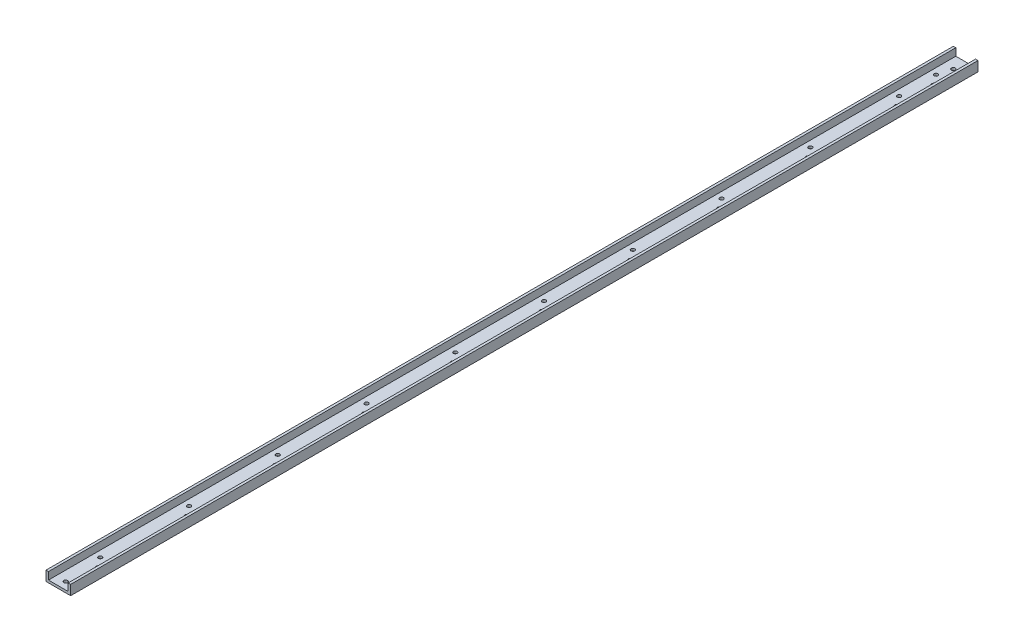
ISO-10303-21;
HEADER;
FILE_DESCRIPTION(('STEP AP214'),'2;1');
FILE_NAME('part.step','',(''),(''),'','','');
FILE_SCHEMA(('AUTOMOTIVE_DESIGN { 1 0 10303 214 1 1 1 1 }'));
ENDSEC;
DATA;
#1=APPLICATION_CONTEXT('core data for automotive mechanical design processes');
#2=APPLICATION_PROTOCOL_DEFINITION('international standard','automotive_design',2000,#1);
#3=PRODUCT_CONTEXT('',#1,'mechanical');
#4=PRODUCT('Part','Part','',(#3));
#5=PRODUCT_RELATED_PRODUCT_CATEGORY('part','',(#4));
#6=PRODUCT_DEFINITION_FORMATION('','',#4);
#7=PRODUCT_DEFINITION_CONTEXT('part definition',#1,'design');
#8=PRODUCT_DEFINITION('design','',#6,#7);
#9=PRODUCT_DEFINITION_SHAPE('','',#8);
#10=(LENGTH_UNIT() NAMED_UNIT(*) SI_UNIT(.MILLI.,.METRE.));
#11=(NAMED_UNIT(*) PLANE_ANGLE_UNIT() SI_UNIT($,.RADIAN.));
#12=(NAMED_UNIT(*) SI_UNIT($,.STERADIAN.) SOLID_ANGLE_UNIT());
#13=UNCERTAINTY_MEASURE_WITH_UNIT(LENGTH_MEASURE(1.E-05),#10,'distance_accuracy_value','');
#14=(GEOMETRIC_REPRESENTATION_CONTEXT(3) GLOBAL_UNCERTAINTY_ASSIGNED_CONTEXT((#13)) GLOBAL_UNIT_ASSIGNED_CONTEXT((#10,
#11,#12)) REPRESENTATION_CONTEXT('',''));
#15=CARTESIAN_POINT('',(0.,0.,0.));
#16=DIRECTION('',(0.,0.,1.));
#17=DIRECTION('',(1.,0.,0.));
#18=AXIS2_PLACEMENT_3D('',#15,#16,#17);
#19=CARTESIAN_POINT('',(20.6375,-0.00100000000000013,93.6624999999999));
#20=DIRECTION('',(0.,1.,0.));
#21=DIRECTION('',(0.,0.,1.));
#22=AXIS2_PLACEMENT_3D('',#19,#20,#21);
#23=CYLINDRICAL_SURFACE('',#22,2.41300000000001);
#24=CARTESIAN_POINT('',(20.6375,3.175,93.6624999999999));
#25=DIRECTION('',(0.,1.,0.));
#26=DIRECTION('',(0.,0.,1.));
#27=AXIS2_PLACEMENT_3D('',#24,#25,#26);
#28=CIRCLE('',#27,2.41300000000001);
#29=CARTESIAN_POINT('',(20.6375,3.175,96.0754999999999));
#30=VERTEX_POINT('',#29);
#31=EDGE_CURVE('E48',#30,#30,#28,.T.);
#32=ORIENTED_EDGE('',*,*,#31,.T.);
#33=EDGE_LOOP('',(#32));
#34=FACE_BOUND('',#33,.T.);
#35=CARTESIAN_POINT('',(20.6375,0.,93.6624999999999));
#36=DIRECTION('',(0.,1.,0.));
#37=DIRECTION('',(0.,0.,1.));
#38=AXIS2_PLACEMENT_3D('',#35,#36,#37);
#39=CIRCLE('',#38,2.41300000000001);
#40=CARTESIAN_POINT('',(20.6375,0.,96.0754999999999));
#41=VERTEX_POINT('',#40);
#42=EDGE_CURVE('E11',#41,#41,#39,.F.);
#43=ORIENTED_EDGE('',*,*,#42,.T.);
#44=EDGE_LOOP('',(#43));
#45=FACE_BOUND('',#44,.T.);
#46=ADVANCED_FACE('F39',(#34,#45),#23,.F.);
#47=CARTESIAN_POINT('',(20.6375,-0.00100000000000013,207.9625));
#48=DIRECTION('',(0.,1.,0.));
#49=DIRECTION('',(0.,0.,1.));
#50=AXIS2_PLACEMENT_3D('',#47,#48,#49);
#51=CYLINDRICAL_SURFACE('',#50,2.41300000000001);
#52=CARTESIAN_POINT('',(20.6375,3.175,207.9625));
#53=DIRECTION('',(0.,1.,0.));
#54=DIRECTION('',(0.,0.,1.));
#55=AXIS2_PLACEMENT_3D('',#52,#53,#54);
#56=CIRCLE('',#55,2.41300000000001);
#57=CARTESIAN_POINT('',(20.6375,3.175,210.3755));
#58=VERTEX_POINT('',#57);
#59=EDGE_CURVE('E274',#58,#58,#56,.T.);
#60=ORIENTED_EDGE('',*,*,#59,.T.);
#61=EDGE_LOOP('',(#60));
#62=FACE_BOUND('',#61,.T.);
#63=CARTESIAN_POINT('',(20.6375,0.,207.9625));
#64=DIRECTION('',(0.,1.,0.));
#65=DIRECTION('',(0.,0.,1.));
#66=AXIS2_PLACEMENT_3D('',#63,#64,#65);
#67=CIRCLE('',#66,2.41300000000001);
#68=CARTESIAN_POINT('',(20.6375,0.,210.3755));
#69=VERTEX_POINT('',#68);
#70=EDGE_CURVE('E277',#69,#69,#67,.F.);
#71=ORIENTED_EDGE('',*,*,#70,.T.);
#72=EDGE_LOOP('',(#71));
#73=FACE_BOUND('',#72,.T.);
#74=ADVANCED_FACE('F301',(#62,#73),#51,.F.);
#75=CARTESIAN_POINT('',(20.6375,-0.00100000000000013,322.2625));
#76=DIRECTION('',(0.,1.,0.));
#77=DIRECTION('',(0.,0.,1.));
#78=AXIS2_PLACEMENT_3D('',#75,#76,#77);
#79=CYLINDRICAL_SURFACE('',#78,2.41300000000001);
#80=CARTESIAN_POINT('',(20.6375,3.175,322.2625));
#81=DIRECTION('',(0.,1.,0.));
#82=DIRECTION('',(0.,0.,1.));
#83=AXIS2_PLACEMENT_3D('',#80,#81,#82);
#84=CIRCLE('',#83,2.41300000000001);
#85=CARTESIAN_POINT('',(20.6375,3.175,324.6755));
#86=VERTEX_POINT('',#85);
#87=EDGE_CURVE('E268',#86,#86,#84,.T.);
#88=ORIENTED_EDGE('',*,*,#87,.T.);
#89=EDGE_LOOP('',(#88));
#90=FACE_BOUND('',#89,.T.);
#91=CARTESIAN_POINT('',(20.6375,0.,322.2625));
#92=DIRECTION('',(0.,1.,0.));
#93=DIRECTION('',(0.,0.,1.));
#94=AXIS2_PLACEMENT_3D('',#91,#92,#93);
#95=CIRCLE('',#94,2.41300000000001);
#96=CARTESIAN_POINT('',(20.6375,0.,324.6755));
#97=VERTEX_POINT('',#96);
#98=EDGE_CURVE('E271',#97,#97,#95,.F.);
#99=ORIENTED_EDGE('',*,*,#98,.T.);
#100=EDGE_LOOP('',(#99));
#101=FACE_BOUND('',#100,.T.);
#102=ADVANCED_FACE('F305',(#90,#101),#79,.F.);
#103=CARTESIAN_POINT('',(20.6375,-0.00100000000000013,436.5625));
#104=DIRECTION('',(0.,1.,0.));
#105=DIRECTION('',(0.,0.,1.));
#106=AXIS2_PLACEMENT_3D('',#103,#104,#105);
#107=CYLINDRICAL_SURFACE('',#106,2.41300000000001);
#108=CARTESIAN_POINT('',(20.6375,3.175,436.5625));
#109=DIRECTION('',(0.,1.,0.));
#110=DIRECTION('',(0.,0.,1.));
#111=AXIS2_PLACEMENT_3D('',#108,#109,#110);
#112=CIRCLE('',#111,2.41300000000001);
#113=CARTESIAN_POINT('',(20.6375,3.175,438.9755));
#114=VERTEX_POINT('',#113);
#115=EDGE_CURVE('E262',#114,#114,#112,.T.);
#116=ORIENTED_EDGE('',*,*,#115,.T.);
#117=EDGE_LOOP('',(#116));
#118=FACE_BOUND('',#117,.T.);
#119=CARTESIAN_POINT('',(20.6375,0.,436.5625));
#120=DIRECTION('',(0.,1.,0.));
#121=DIRECTION('',(0.,0.,1.));
#122=AXIS2_PLACEMENT_3D('',#119,#120,#121);
#123=CIRCLE('',#122,2.41300000000001);
#124=CARTESIAN_POINT('',(20.6375,0.,438.9755));
#125=VERTEX_POINT('',#124);
#126=EDGE_CURVE('E265',#125,#125,#123,.F.);
#127=ORIENTED_EDGE('',*,*,#126,.T.);
#128=EDGE_LOOP('',(#127));
#129=FACE_BOUND('',#128,.T.);
#130=ADVANCED_FACE('F310',(#118,#129),#107,.F.);
#131=CARTESIAN_POINT('',(20.6375,-0.00100000000000013,550.8625));
#132=DIRECTION('',(0.,1.,0.));
#133=DIRECTION('',(0.,0.,1.));
#134=AXIS2_PLACEMENT_3D('',#131,#132,#133);
#135=CYLINDRICAL_SURFACE('',#134,2.41300000000001);
#136=CARTESIAN_POINT('',(20.6375,3.175,550.8625));
#137=DIRECTION('',(0.,1.,0.));
#138=DIRECTION('',(0.,0.,1.));
#139=AXIS2_PLACEMENT_3D('',#136,#137,#138);
#140=CIRCLE('',#139,2.41300000000001);
#141=CARTESIAN_POINT('',(20.6375,3.175,553.2755));
#142=VERTEX_POINT('',#141);
#143=EDGE_CURVE('E256',#142,#142,#140,.T.);
#144=ORIENTED_EDGE('',*,*,#143,.T.);
#145=EDGE_LOOP('',(#144));
#146=FACE_BOUND('',#145,.T.);
#147=CARTESIAN_POINT('',(20.6375,0.,550.8625));
#148=DIRECTION('',(0.,1.,0.));
#149=DIRECTION('',(0.,0.,1.));
#150=AXIS2_PLACEMENT_3D('',#147,#148,#149);
#151=CIRCLE('',#150,2.41300000000001);
#152=CARTESIAN_POINT('',(20.6375,0.,553.2755));
#153=VERTEX_POINT('',#152);
#154=EDGE_CURVE('E259',#153,#153,#151,.F.);
#155=ORIENTED_EDGE('',*,*,#154,.T.);
#156=EDGE_LOOP('',(#155));
#157=FACE_BOUND('',#156,.T.);
#158=ADVANCED_FACE('F317',(#146,#157),#135,.F.);
#159=CARTESIAN_POINT('',(20.6375,-0.00100000000000013,665.1625));
#160=DIRECTION('',(0.,1.,0.));
#161=DIRECTION('',(0.,0.,1.));
#162=AXIS2_PLACEMENT_3D('',#159,#160,#161);
#163=CYLINDRICAL_SURFACE('',#162,2.41300000000001);
#164=CARTESIAN_POINT('',(20.6375,3.175,665.1625));
#165=DIRECTION('',(0.,1.,0.));
#166=DIRECTION('',(0.,0.,1.));
#167=AXIS2_PLACEMENT_3D('',#164,#165,#166);
#168=CIRCLE('',#167,2.41300000000001);
#169=CARTESIAN_POINT('',(20.6375,3.175,667.5755));
#170=VERTEX_POINT('',#169);
#171=EDGE_CURVE('E250',#170,#170,#168,.T.);
#172=ORIENTED_EDGE('',*,*,#171,.T.);
#173=EDGE_LOOP('',(#172));
#174=FACE_BOUND('',#173,.T.);
#175=CARTESIAN_POINT('',(20.6375,0.,665.1625));
#176=DIRECTION('',(0.,1.,0.));
#177=DIRECTION('',(0.,0.,1.));
#178=AXIS2_PLACEMENT_3D('',#175,#176,#177);
#179=CIRCLE('',#178,2.41300000000001);
#180=CARTESIAN_POINT('',(20.6375,0.,667.5755));
#181=VERTEX_POINT('',#180);
#182=EDGE_CURVE('E253',#181,#181,#179,.F.);
#183=ORIENTED_EDGE('',*,*,#182,.T.);
#184=EDGE_LOOP('',(#183));
#185=FACE_BOUND('',#184,.T.);
#186=ADVANCED_FACE('F321',(#174,#185),#163,.F.);
#187=CARTESIAN_POINT('',(20.6375,-0.00100000000000013,779.4625));
#188=DIRECTION('',(0.,1.,0.));
#189=DIRECTION('',(0.,0.,1.));
#190=AXIS2_PLACEMENT_3D('',#187,#188,#189);
#191=CYLINDRICAL_SURFACE('',#190,2.41300000000001);
#192=CARTESIAN_POINT('',(20.6375,3.175,779.4625));
#193=DIRECTION('',(0.,1.,0.));
#194=DIRECTION('',(0.,0.,1.));
#195=AXIS2_PLACEMENT_3D('',#192,#193,#194);
#196=CIRCLE('',#195,2.41300000000001);
#197=CARTESIAN_POINT('',(20.6375,3.175,781.8755));
#198=VERTEX_POINT('',#197);
#199=EDGE_CURVE('E244',#198,#198,#196,.T.);
#200=ORIENTED_EDGE('',*,*,#199,.T.);
#201=EDGE_LOOP('',(#200));
#202=FACE_BOUND('',#201,.T.);
#203=CARTESIAN_POINT('',(20.6375,0.,779.4625));
#204=DIRECTION('',(0.,1.,0.));
#205=DIRECTION('',(0.,0.,1.));
#206=AXIS2_PLACEMENT_3D('',#203,#204,#205);
#207=CIRCLE('',#206,2.41300000000001);
#208=CARTESIAN_POINT('',(20.6375,0.,781.8755));
#209=VERTEX_POINT('',#208);
#210=EDGE_CURVE('E247',#209,#209,#207,.F.);
#211=ORIENTED_EDGE('',*,*,#210,.T.);
#212=EDGE_LOOP('',(#211));
#213=FACE_BOUND('',#212,.T.);
#214=ADVANCED_FACE('F325',(#202,#213),#191,.F.);
#215=CARTESIAN_POINT('',(20.6375,-0.00100000000000013,893.7625));
#216=DIRECTION('',(0.,1.,0.));
#217=DIRECTION('',(0.,0.,1.));
#218=AXIS2_PLACEMENT_3D('',#215,#216,#217);
#219=CYLINDRICAL_SURFACE('',#218,2.41300000000001);
#220=CARTESIAN_POINT('',(20.6375,3.175,893.7625));
#221=DIRECTION('',(0.,1.,0.));
#222=DIRECTION('',(0.,0.,1.));
#223=AXIS2_PLACEMENT_3D('',#220,#221,#222);
#224=CIRCLE('',#223,2.41300000000001);
#225=CARTESIAN_POINT('',(20.6375,3.175,896.1755));
#226=VERTEX_POINT('',#225);
#227=EDGE_CURVE('E238',#226,#226,#224,.T.);
#228=ORIENTED_EDGE('',*,*,#227,.T.);
#229=EDGE_LOOP('',(#228));
#230=FACE_BOUND('',#229,.T.);
#231=CARTESIAN_POINT('',(20.6375,0.,893.7625));
#232=DIRECTION('',(0.,1.,0.));
#233=DIRECTION('',(0.,0.,1.));
#234=AXIS2_PLACEMENT_3D('',#231,#232,#233);
#235=CIRCLE('',#234,2.41300000000001);
#236=CARTESIAN_POINT('',(20.6375,0.,896.1755));
#237=VERTEX_POINT('',#236);
#238=EDGE_CURVE('E241',#237,#237,#235,.F.);
#239=ORIENTED_EDGE('',*,*,#238,.T.);
#240=EDGE_LOOP('',(#239));
#241=FACE_BOUND('',#240,.T.);
#242=ADVANCED_FACE('F329',(#230,#241),#219,.F.);
#243=CARTESIAN_POINT('',(11.1125,-0.00100000000000013,80.9625));
#244=DIRECTION('',(0.,1.,0.));
#245=DIRECTION('',(0.,0.,1.));
#246=AXIS2_PLACEMENT_3D('',#243,#244,#245);
#247=CYLINDRICAL_SURFACE('',#246,2.41300000000005);
#248=CARTESIAN_POINT('',(11.1125,3.175,80.9625));
#249=DIRECTION('',(0.,1.,0.));
#250=DIRECTION('',(0.,0.,1.));
#251=AXIS2_PLACEMENT_3D('',#248,#249,#250);
#252=CIRCLE('',#251,2.41300000000005);
#253=CARTESIAN_POINT('',(11.1125,3.175,83.3755000000001));
#254=VERTEX_POINT('',#253);
#255=EDGE_CURVE('E231',#254,#254,#252,.T.);
#256=ORIENTED_EDGE('',*,*,#255,.T.);
#257=EDGE_LOOP('',(#256));
#258=FACE_BOUND('',#257,.T.);
#259=CARTESIAN_POINT('',(11.1125,0.,80.9625));
#260=DIRECTION('',(0.,1.,0.));
#261=DIRECTION('',(0.,0.,1.));
#262=AXIS2_PLACEMENT_3D('',#259,#260,#261);
#263=CIRCLE('',#262,2.41300000000005);
#264=CARTESIAN_POINT('',(11.1125,0.,83.3755000000001));
#265=VERTEX_POINT('',#264);
#266=EDGE_CURVE('E234',#265,#265,#263,.F.);
#267=ORIENTED_EDGE('',*,*,#266,.T.);
#268=EDGE_LOOP('',(#267));
#269=FACE_BOUND('',#268,.T.);
#270=ADVANCED_FACE('F333',(#258,#269),#247,.F.);
#271=CARTESIAN_POINT('',(11.1125,-0.00100000000000013,195.2625));
#272=DIRECTION('',(0.,1.,0.));
#273=DIRECTION('',(0.,0.,1.));
#274=AXIS2_PLACEMENT_3D('',#271,#272,#273);
#275=CYLINDRICAL_SURFACE('',#274,2.41300000000005);
#276=CARTESIAN_POINT('',(11.1125,3.175,195.2625));
#277=DIRECTION('',(0.,1.,0.));
#278=DIRECTION('',(0.,0.,1.));
#279=AXIS2_PLACEMENT_3D('',#276,#277,#278);
#280=CIRCLE('',#279,2.41300000000005);
#281=CARTESIAN_POINT('',(11.1125,3.175,197.6755));
#282=VERTEX_POINT('',#281);
#283=EDGE_CURVE('E225',#282,#282,#280,.T.);
#284=ORIENTED_EDGE('',*,*,#283,.T.);
#285=EDGE_LOOP('',(#284));
#286=FACE_BOUND('',#285,.T.);
#287=CARTESIAN_POINT('',(11.1125,0.,195.2625));
#288=DIRECTION('',(0.,1.,0.));
#289=DIRECTION('',(0.,0.,1.));
#290=AXIS2_PLACEMENT_3D('',#287,#288,#289);
#291=CIRCLE('',#290,2.41300000000005);
#292=CARTESIAN_POINT('',(11.1125,0.,197.6755));
#293=VERTEX_POINT('',#292);
#294=EDGE_CURVE('E228',#293,#293,#291,.F.);
#295=ORIENTED_EDGE('',*,*,#294,.T.);
#296=EDGE_LOOP('',(#295));
#297=FACE_BOUND('',#296,.T.);
#298=ADVANCED_FACE('F337',(#286,#297),#275,.F.);
#299=CARTESIAN_POINT('',(11.1125,-0.00100000000000013,309.5625));
#300=DIRECTION('',(0.,1.,0.));
#301=DIRECTION('',(0.,0.,1.));
#302=AXIS2_PLACEMENT_3D('',#299,#300,#301);
#303=CYLINDRICAL_SURFACE('',#302,2.41300000000005);
#304=CARTESIAN_POINT('',(11.1125,3.175,309.5625));
#305=DIRECTION('',(0.,1.,0.));
#306=DIRECTION('',(0.,0.,1.));
#307=AXIS2_PLACEMENT_3D('',#304,#305,#306);
#308=CIRCLE('',#307,2.41300000000005);
#309=CARTESIAN_POINT('',(11.1125,3.175,311.9755));
#310=VERTEX_POINT('',#309);
#311=EDGE_CURVE('E219',#310,#310,#308,.T.);
#312=ORIENTED_EDGE('',*,*,#311,.T.);
#313=EDGE_LOOP('',(#312));
#314=FACE_BOUND('',#313,.T.);
#315=CARTESIAN_POINT('',(11.1125,0.,309.5625));
#316=DIRECTION('',(0.,1.,0.));
#317=DIRECTION('',(0.,0.,1.));
#318=AXIS2_PLACEMENT_3D('',#315,#316,#317);
#319=CIRCLE('',#318,2.41300000000005);
#320=CARTESIAN_POINT('',(11.1125,0.,311.9755));
#321=VERTEX_POINT('',#320);
#322=EDGE_CURVE('E222',#321,#321,#319,.F.);
#323=ORIENTED_EDGE('',*,*,#322,.T.);
#324=EDGE_LOOP('',(#323));
#325=FACE_BOUND('',#324,.T.);
#326=ADVANCED_FACE('F341',(#314,#325),#303,.F.);
#327=CARTESIAN_POINT('',(11.1125,-0.00100000000000013,423.8625));
#328=DIRECTION('',(0.,1.,0.));
#329=DIRECTION('',(0.,0.,1.));
#330=AXIS2_PLACEMENT_3D('',#327,#328,#329);
#331=CYLINDRICAL_SURFACE('',#330,2.41300000000005);
#332=CARTESIAN_POINT('',(11.1125,3.175,423.8625));
#333=DIRECTION('',(0.,1.,0.));
#334=DIRECTION('',(0.,0.,1.));
#335=AXIS2_PLACEMENT_3D('',#332,#333,#334);
#336=CIRCLE('',#335,2.41300000000005);
#337=CARTESIAN_POINT('',(11.1125,3.175,426.2755));
#338=VERTEX_POINT('',#337);
#339=EDGE_CURVE('E213',#338,#338,#336,.T.);
#340=ORIENTED_EDGE('',*,*,#339,.T.);
#341=EDGE_LOOP('',(#340));
#342=FACE_BOUND('',#341,.T.);
#343=CARTESIAN_POINT('',(11.1125,0.,423.8625));
#344=DIRECTION('',(0.,1.,0.));
#345=DIRECTION('',(0.,0.,1.));
#346=AXIS2_PLACEMENT_3D('',#343,#344,#345);
#347=CIRCLE('',#346,2.41300000000005);
#348=CARTESIAN_POINT('',(11.1125,0.,426.2755));
#349=VERTEX_POINT('',#348);
#350=EDGE_CURVE('E216',#349,#349,#347,.F.);
#351=ORIENTED_EDGE('',*,*,#350,.T.);
#352=EDGE_LOOP('',(#351));
#353=FACE_BOUND('',#352,.T.);
#354=ADVANCED_FACE('F345',(#342,#353),#331,.F.);
#355=CARTESIAN_POINT('',(11.1125,-0.00100000000000013,538.1625));
#356=DIRECTION('',(0.,1.,0.));
#357=DIRECTION('',(0.,0.,1.));
#358=AXIS2_PLACEMENT_3D('',#355,#356,#357);
#359=CYLINDRICAL_SURFACE('',#358,2.41300000000005);
#360=CARTESIAN_POINT('',(11.1125,3.175,538.1625));
#361=DIRECTION('',(0.,1.,0.));
#362=DIRECTION('',(0.,0.,1.));
#363=AXIS2_PLACEMENT_3D('',#360,#361,#362);
#364=CIRCLE('',#363,2.41300000000005);
#365=CARTESIAN_POINT('',(11.1125,3.175,540.5755));
#366=VERTEX_POINT('',#365);
#367=EDGE_CURVE('E207',#366,#366,#364,.T.);
#368=ORIENTED_EDGE('',*,*,#367,.T.);
#369=EDGE_LOOP('',(#368));
#370=FACE_BOUND('',#369,.T.);
#371=CARTESIAN_POINT('',(11.1125,0.,538.1625));
#372=DIRECTION('',(0.,1.,0.));
#373=DIRECTION('',(0.,0.,1.));
#374=AXIS2_PLACEMENT_3D('',#371,#372,#373);
#375=CIRCLE('',#374,2.41300000000005);
#376=CARTESIAN_POINT('',(11.1125,0.,540.5755));
#377=VERTEX_POINT('',#376);
#378=EDGE_CURVE('E210',#377,#377,#375,.F.);
#379=ORIENTED_EDGE('',*,*,#378,.T.);
#380=EDGE_LOOP('',(#379));
#381=FACE_BOUND('',#380,.T.);
#382=ADVANCED_FACE('F349',(#370,#381),#359,.F.);
#383=CARTESIAN_POINT('',(11.1125,-0.00100000000000013,652.4625));
#384=DIRECTION('',(0.,1.,0.));
#385=DIRECTION('',(0.,0.,1.));
#386=AXIS2_PLACEMENT_3D('',#383,#384,#385);
#387=CYLINDRICAL_SURFACE('',#386,2.41300000000005);
#388=CARTESIAN_POINT('',(11.1125,3.175,652.4625));
#389=DIRECTION('',(0.,1.,0.));
#390=DIRECTION('',(0.,0.,1.));
#391=AXIS2_PLACEMENT_3D('',#388,#389,#390);
#392=CIRCLE('',#391,2.41300000000005);
#393=CARTESIAN_POINT('',(11.1125,3.175,654.8755));
#394=VERTEX_POINT('',#393);
#395=EDGE_CURVE('E201',#394,#394,#392,.T.);
#396=ORIENTED_EDGE('',*,*,#395,.T.);
#397=EDGE_LOOP('',(#396));
#398=FACE_BOUND('',#397,.T.);
#399=CARTESIAN_POINT('',(11.1125,0.,652.4625));
#400=DIRECTION('',(0.,1.,0.));
#401=DIRECTION('',(0.,0.,1.));
#402=AXIS2_PLACEMENT_3D('',#399,#400,#401);
#403=CIRCLE('',#402,2.41300000000005);
#404=CARTESIAN_POINT('',(11.1125,0.,654.8755));
#405=VERTEX_POINT('',#404);
#406=EDGE_CURVE('E204',#405,#405,#403,.F.);
#407=ORIENTED_EDGE('',*,*,#406,.T.);
#408=EDGE_LOOP('',(#407));
#409=FACE_BOUND('',#408,.T.);
#410=ADVANCED_FACE('F353',(#398,#409),#387,.F.);
#411=CARTESIAN_POINT('',(11.1125,-0.00100000000000013,766.7625));
#412=DIRECTION('',(0.,1.,0.));
#413=DIRECTION('',(0.,0.,1.));
#414=AXIS2_PLACEMENT_3D('',#411,#412,#413);
#415=CYLINDRICAL_SURFACE('',#414,2.41300000000005);
#416=CARTESIAN_POINT('',(11.1125,3.175,766.7625));
#417=DIRECTION('',(0.,1.,0.));
#418=DIRECTION('',(0.,0.,1.));
#419=AXIS2_PLACEMENT_3D('',#416,#417,#418);
#420=CIRCLE('',#419,2.41300000000005);
#421=CARTESIAN_POINT('',(11.1125,3.175,769.1755));
#422=VERTEX_POINT('',#421);
#423=EDGE_CURVE('E195',#422,#422,#420,.T.);
#424=ORIENTED_EDGE('',*,*,#423,.T.);
#425=EDGE_LOOP('',(#424));
#426=FACE_BOUND('',#425,.T.);
#427=CARTESIAN_POINT('',(11.1125,0.,766.7625));
#428=DIRECTION('',(0.,1.,0.));
#429=DIRECTION('',(0.,0.,1.));
#430=AXIS2_PLACEMENT_3D('',#427,#428,#429);
#431=CIRCLE('',#430,2.41300000000005);
#432=CARTESIAN_POINT('',(11.1125,0.,769.1755));
#433=VERTEX_POINT('',#432);
#434=EDGE_CURVE('E198',#433,#433,#431,.F.);
#435=ORIENTED_EDGE('',*,*,#434,.T.);
#436=EDGE_LOOP('',(#435));
#437=FACE_BOUND('',#436,.T.);
#438=ADVANCED_FACE('F357',(#426,#437),#415,.F.);
#439=CARTESIAN_POINT('',(11.1125,-0.00100000000000013,881.0625));
#440=DIRECTION('',(0.,1.,0.));
#441=DIRECTION('',(0.,0.,1.));
#442=AXIS2_PLACEMENT_3D('',#439,#440,#441);
#443=CYLINDRICAL_SURFACE('',#442,2.41300000000005);
#444=CARTESIAN_POINT('',(11.1125,3.175,881.0625));
#445=DIRECTION('',(0.,1.,0.));
#446=DIRECTION('',(0.,0.,1.));
#447=AXIS2_PLACEMENT_3D('',#444,#445,#446);
#448=CIRCLE('',#447,2.41300000000005);
#449=CARTESIAN_POINT('',(11.1125,3.175,883.4755));
#450=VERTEX_POINT('',#449);
#451=EDGE_CURVE('E189',#450,#450,#448,.T.);
#452=ORIENTED_EDGE('',*,*,#451,.T.);
#453=EDGE_LOOP('',(#452));
#454=FACE_BOUND('',#453,.T.);
#455=CARTESIAN_POINT('',(11.1125,0.,881.0625));
#456=DIRECTION('',(0.,1.,0.));
#457=DIRECTION('',(0.,0.,1.));
#458=AXIS2_PLACEMENT_3D('',#455,#456,#457);
#459=CIRCLE('',#458,2.41300000000005);
#460=CARTESIAN_POINT('',(11.1125,0.,883.4755));
#461=VERTEX_POINT('',#460);
#462=EDGE_CURVE('E192',#461,#461,#459,.F.);
#463=ORIENTED_EDGE('',*,*,#462,.T.);
#464=EDGE_LOOP('',(#463));
#465=FACE_BOUND('',#464,.T.);
#466=ADVANCED_FACE('F361',(#454,#465),#443,.F.);
#467=CARTESIAN_POINT('',(0.,0.,1168.4));
#468=DIRECTION('',(1.,0.,0.));
#469=DIRECTION('',(0.,0.,-1.));
#470=AXIS2_PLACEMENT_3D('',#467,#468,#469);
#471=PLANE('',#470);
#472=DIRECTION('',(0.,-1.,0.));
#473=VECTOR('',#472,1.);
#474=CARTESIAN_POINT('',(0.,0.,0.));
#475=LINE('',#474,#473);
#476=CARTESIAN_POINT('',(0.,12.7,0.));
#477=VERTEX_POINT('',#476);
#478=CARTESIAN_POINT('',(0.,0.,0.));
#479=VERTEX_POINT('',#478);
#480=EDGE_CURVE('E145',#477,#479,#475,.T.);
#481=ORIENTED_EDGE('',*,*,#480,.T.);
#482=DIRECTION('',(0.,0.,-1.));
#483=VECTOR('',#482,1.);
#484=CARTESIAN_POINT('',(0.,0.,1168.4));
#485=LINE('',#484,#483);
#486=CARTESIAN_POINT('',(0.,0.,1168.4));
#487=VERTEX_POINT('',#486);
#488=EDGE_CURVE('E187',#487,#479,#485,.T.);
#489=ORIENTED_EDGE('',*,*,#488,.F.);
#490=DIRECTION('',(0.,-1.,0.));
#491=VECTOR('',#490,1.);
#492=CARTESIAN_POINT('',(0.,0.,1168.4));
#493=LINE('',#492,#491);
#494=CARTESIAN_POINT('',(0.,12.7,1168.4));
#495=VERTEX_POINT('',#494);
#496=EDGE_CURVE('E168',#495,#487,#493,.T.);
#497=ORIENTED_EDGE('',*,*,#496,.F.);
#498=DIRECTION('',(0.,0.,-1.));
#499=VECTOR('',#498,1.);
#500=CARTESIAN_POINT('',(0.,12.7,1168.4));
#501=LINE('',#500,#499);
#502=EDGE_CURVE('E141',#495,#477,#501,.T.);
#503=ORIENTED_EDGE('',*,*,#502,.T.);
#504=EDGE_LOOP('',(#481,#489,#497,#503));
#505=FACE_BOUND('',#504,.T.);
#506=ADVANCED_FACE('F365',(#505),#471,.F.);
#507=CARTESIAN_POINT('',(0.,0.,1168.4));
#508=DIRECTION('',(0.,1.,0.));
#509=DIRECTION('',(0.,0.,1.));
#510=AXIS2_PLACEMENT_3D('',#507,#508,#509);
#511=PLANE('',#510);
#512=CARTESIAN_POINT('',(15.875,0.,15.875));
#513=DIRECTION('',(0.,1.,0.));
#514=DIRECTION('',(0.,0.,1.));
#515=AXIS2_PLACEMENT_3D('',#512,#513,#514);
#516=CIRCLE('',#515,2.413);
#517=CARTESIAN_POINT('',(15.875,0.,18.288));
#518=VERTEX_POINT('',#517);
#519=EDGE_CURVE('E438',#518,#518,#516,.F.);
#520=ORIENTED_EDGE('',*,*,#519,.F.);
#521=EDGE_LOOP('',(#520));
#522=FACE_BOUND('',#521,.T.);
#523=CARTESIAN_POINT('',(20.6375,0.,46.0374999999997));
#524=DIRECTION('',(0.,1.,0.));
#525=DIRECTION('',(0.,0.,1.));
#526=AXIS2_PLACEMENT_3D('',#523,#524,#525);
#527=CIRCLE('',#526,2.41299999999999);
#528=CARTESIAN_POINT('',(20.6375,0.,48.4504999999997));
#529=VERTEX_POINT('',#528);
#530=EDGE_CURVE('E448',#529,#529,#527,.T.);
#531=ORIENTED_EDGE('',*,*,#530,.T.);
#532=EDGE_LOOP('',(#531));
#533=FACE_BOUND('',#532,.T.);
#534=CARTESIAN_POINT('',(11.1125,0.,33.3374999999998));
#535=DIRECTION('',(0.,1.,0.));
#536=DIRECTION('',(0.,0.,1.));
#537=AXIS2_PLACEMENT_3D('',#534,#535,#536);
#538=CIRCLE('',#537,2.413);
#539=CARTESIAN_POINT('',(11.1125,0.,35.7504999999998));
#540=VERTEX_POINT('',#539);
#541=EDGE_CURVE('E444',#540,#540,#538,.T.);
#542=ORIENTED_EDGE('',*,*,#541,.T.);
#543=EDGE_LOOP('',(#542));
#544=FACE_BOUND('',#543,.T.);
#545=CARTESIAN_POINT('',(20.6375,0.,1008.0625));
#546=DIRECTION('',(0.,1.,0.));
#547=DIRECTION('',(0.,0.,1.));
#548=AXIS2_PLACEMENT_3D('',#545,#546,#547);
#549=CIRCLE('',#548,2.41300000000001);
#550=CARTESIAN_POINT('',(20.6375,0.,1010.4755));
#551=VERTEX_POINT('',#550);
#552=EDGE_CURVE('E459',#551,#551,#549,.F.);
#553=ORIENTED_EDGE('',*,*,#552,.F.);
#554=EDGE_LOOP('',(#553));
#555=FACE_BOUND('',#554,.T.);
#556=CARTESIAN_POINT('',(11.1125,0.,995.3625));
#557=DIRECTION('',(0.,1.,0.));
#558=DIRECTION('',(0.,0.,1.));
#559=AXIS2_PLACEMENT_3D('',#556,#557,#558);
#560=CIRCLE('',#559,2.41300000000005);
#561=CARTESIAN_POINT('',(11.1125,0.,997.7755));
#562=VERTEX_POINT('',#561);
#563=EDGE_CURVE('E465',#562,#562,#560,.F.);
#564=ORIENTED_EDGE('',*,*,#563,.F.);
#565=EDGE_LOOP('',(#564));
#566=FACE_BOUND('',#565,.T.);
#567=CARTESIAN_POINT('',(15.875,0.,1158.875));
#568=DIRECTION('',(0.,1.,0.));
#569=DIRECTION('',(0.,0.,1.));
#570=AXIS2_PLACEMENT_3D('',#567,#568,#569);
#571=CIRCLE('',#570,2.41299999999998);
#572=CARTESIAN_POINT('',(15.875,0.,1161.288));
#573=VERTEX_POINT('',#572);
#574=EDGE_CURVE('E471',#573,#573,#571,.F.);
#575=ORIENTED_EDGE('',*,*,#574,.F.);
#576=EDGE_LOOP('',(#575));
#577=FACE_BOUND('',#576,.T.);
#578=CARTESIAN_POINT('',(11.1125,0.,1109.6625));
#579=DIRECTION('',(0.,1.,0.));
#580=DIRECTION('',(0.,0.,1.));
#581=AXIS2_PLACEMENT_3D('',#578,#579,#580);
#582=CIRCLE('',#581,2.41300000000005);
#583=CARTESIAN_POINT('',(11.1125,0.,1112.0755));
#584=VERTEX_POINT('',#583);
#585=EDGE_CURVE('E150',#584,#584,#582,.F.);
#586=ORIENTED_EDGE('',*,*,#585,.F.);
#587=EDGE_LOOP('',(#586));
#588=FACE_BOUND('',#587,.T.);
#589=CARTESIAN_POINT('',(20.6375,0.,1122.3625));
#590=DIRECTION('',(0.,1.,0.));
#591=DIRECTION('',(0.,0.,1.));
#592=AXIS2_PLACEMENT_3D('',#589,#590,#591);
#593=CIRCLE('',#592,2.41300000000001);
#594=CARTESIAN_POINT('',(20.6375,0.,1124.7755));
#595=VERTEX_POINT('',#594);
#596=EDGE_CURVE('E478',#595,#595,#593,.F.);
#597=ORIENTED_EDGE('',*,*,#596,.F.);
#598=EDGE_LOOP('',(#597));
#599=FACE_BOUND('',#598,.T.);
#600=DIRECTION('',(1.,0.,0.));
#601=VECTOR('',#600,1.);
#602=CARTESIAN_POINT('',(0.,0.,0.));
#603=LINE('',#602,#601);
#604=CARTESIAN_POINT('',(31.75,0.,0.));
#605=VERTEX_POINT('',#604);
#606=EDGE_CURVE('E149',#479,#605,#603,.T.);
#607=ORIENTED_EDGE('',*,*,#606,.T.);
#608=DIRECTION('',(0.,0.,-1.));
#609=VECTOR('',#608,1.);
#610=CARTESIAN_POINT('',(31.75,0.,1168.4));
#611=LINE('',#610,#609);
#612=CARTESIAN_POINT('',(31.75,0.,1168.4));
#613=VERTEX_POINT('',#612);
#614=EDGE_CURVE('E183',#613,#605,#611,.T.);
#615=ORIENTED_EDGE('',*,*,#614,.F.);
#616=DIRECTION('',(1.,0.,0.));
#617=VECTOR('',#616,1.);
#618=CARTESIAN_POINT('',(0.,0.,1168.4));
#619=LINE('',#618,#617);
#620=EDGE_CURVE('E106',#487,#613,#619,.T.);
#621=ORIENTED_EDGE('',*,*,#620,.F.);
#622=ORIENTED_EDGE('',*,*,#488,.T.);
#623=EDGE_LOOP('',(#607,#615,#621,#622));
#624=FACE_BOUND('',#623,.T.);
#625=ORIENTED_EDGE('',*,*,#462,.F.);
#626=EDGE_LOOP('',(#625));
#627=FACE_BOUND('',#626,.T.);
#628=ORIENTED_EDGE('',*,*,#434,.F.);
#629=EDGE_LOOP('',(#628));
#630=FACE_BOUND('',#629,.T.);
#631=ORIENTED_EDGE('',*,*,#406,.F.);
#632=EDGE_LOOP('',(#631));
#633=FACE_BOUND('',#632,.T.);
#634=ORIENTED_EDGE('',*,*,#378,.F.);
#635=EDGE_LOOP('',(#634));
#636=FACE_BOUND('',#635,.T.);
#637=ORIENTED_EDGE('',*,*,#350,.F.);
#638=EDGE_LOOP('',(#637));
#639=FACE_BOUND('',#638,.T.);
#640=ORIENTED_EDGE('',*,*,#322,.F.);
#641=EDGE_LOOP('',(#640));
#642=FACE_BOUND('',#641,.T.);
#643=ORIENTED_EDGE('',*,*,#294,.F.);
#644=EDGE_LOOP('',(#643));
#645=FACE_BOUND('',#644,.T.);
#646=ORIENTED_EDGE('',*,*,#266,.F.);
#647=EDGE_LOOP('',(#646));
#648=FACE_BOUND('',#647,.T.);
#649=ORIENTED_EDGE('',*,*,#238,.F.);
#650=EDGE_LOOP('',(#649));
#651=FACE_BOUND('',#650,.T.);
#652=ORIENTED_EDGE('',*,*,#210,.F.);
#653=EDGE_LOOP('',(#652));
#654=FACE_BOUND('',#653,.T.);
#655=ORIENTED_EDGE('',*,*,#182,.F.);
#656=EDGE_LOOP('',(#655));
#657=FACE_BOUND('',#656,.T.);
#658=ORIENTED_EDGE('',*,*,#154,.F.);
#659=EDGE_LOOP('',(#658));
#660=FACE_BOUND('',#659,.T.);
#661=ORIENTED_EDGE('',*,*,#126,.F.);
#662=EDGE_LOOP('',(#661));
#663=FACE_BOUND('',#662,.T.);
#664=ORIENTED_EDGE('',*,*,#98,.F.);
#665=EDGE_LOOP('',(#664));
#666=FACE_BOUND('',#665,.T.);
#667=ORIENTED_EDGE('',*,*,#70,.F.);
#668=EDGE_LOOP('',(#667));
#669=FACE_BOUND('',#668,.T.);
#670=ORIENTED_EDGE('',*,*,#42,.F.);
#671=EDGE_LOOP('',(#670));
#672=FACE_BOUND('',#671,.T.);
#673=ADVANCED_FACE('F369',(#522,#533,#544,#555,#566,#577,#588,#599,#624,#627,#630,#633,#636,
#639,#642,#645,#648,#651,#654,#657,#660,#663,#666,#669,#672),#511,.F.);
#674=CARTESIAN_POINT('',(31.75,0.,1168.4));
#675=DIRECTION('',(-1.,0.,0.));
#676=DIRECTION('',(0.,0.,1.));
#677=AXIS2_PLACEMENT_3D('',#674,#675,#676);
#678=PLANE('',#677);
#679=DIRECTION('',(0.,1.,0.));
#680=VECTOR('',#679,1.);
#681=CARTESIAN_POINT('',(31.75,0.,0.));
#682=LINE('',#681,#680);
#683=CARTESIAN_POINT('',(31.75,12.7,0.));
#684=VERTEX_POINT('',#683);
#685=EDGE_CURVE('E153',#605,#684,#682,.T.);
#686=ORIENTED_EDGE('',*,*,#685,.T.);
#687=DIRECTION('',(0.,0.,-1.));
#688=VECTOR('',#687,1.);
#689=CARTESIAN_POINT('',(31.75,12.7,1168.4));
#690=LINE('',#689,#688);
#691=CARTESIAN_POINT('',(31.75,12.7,1168.4));
#692=VERTEX_POINT('',#691);
#693=EDGE_CURVE('E179',#692,#684,#690,.T.);
#694=ORIENTED_EDGE('',*,*,#693,.F.);
#695=DIRECTION('',(0.,1.,0.));
#696=VECTOR('',#695,1.);
#697=CARTESIAN_POINT('',(31.75,0.,1168.4));
#698=LINE('',#697,#696);
#699=EDGE_CURVE('E487',#613,#692,#698,.T.);
#700=ORIENTED_EDGE('',*,*,#699,.F.);
#701=ORIENTED_EDGE('',*,*,#614,.T.);
#702=EDGE_LOOP('',(#686,#694,#700,#701));
#703=FACE_BOUND('',#702,.T.);
#704=ADVANCED_FACE('F372',(#703),#678,.F.);
#705=CARTESIAN_POINT('',(31.75,12.7,1168.4));
#706=DIRECTION('',(0.,-1.,0.));
#707=DIRECTION('',(0.,0.,-1.));
#708=AXIS2_PLACEMENT_3D('',#705,#706,#707);
#709=PLANE('',#708);
#710=DIRECTION('',(-1.,0.,0.));
#711=VECTOR('',#710,1.);
#712=CARTESIAN_POINT('',(31.75,12.7,0.));
#713=LINE('',#712,#711);
#714=CARTESIAN_POINT('',(28.575,12.7,0.));
#715=VERTEX_POINT('',#714);
#716=EDGE_CURVE('E156',#684,#715,#713,.T.);
#717=ORIENTED_EDGE('',*,*,#716,.T.);
#718=DIRECTION('',(0.,0.,-1.));
#719=VECTOR('',#718,1.);
#720=CARTESIAN_POINT('',(28.575,12.7,1168.4));
#721=LINE('',#720,#719);
#722=CARTESIAN_POINT('',(28.575,12.7,1168.4));
#723=VERTEX_POINT('',#722);
#724=EDGE_CURVE('E175',#723,#715,#721,.T.);
#725=ORIENTED_EDGE('',*,*,#724,.F.);
#726=DIRECTION('',(-1.,0.,0.));
#727=VECTOR('',#726,1.);
#728=CARTESIAN_POINT('',(31.75,12.7,1168.4));
#729=LINE('',#728,#727);
#730=EDGE_CURVE('E489',#692,#723,#729,.T.);
#731=ORIENTED_EDGE('',*,*,#730,.F.);
#732=ORIENTED_EDGE('',*,*,#693,.T.);
#733=EDGE_LOOP('',(#717,#725,#731,#732));
#734=FACE_BOUND('',#733,.T.);
#735=ADVANCED_FACE('F295',(#734),#709,.F.);
#736=CARTESIAN_POINT('',(28.575,3.175,1168.4));
#737=DIRECTION('',(1.,0.,0.));
#738=DIRECTION('',(0.,0.,-1.));
#739=AXIS2_PLACEMENT_3D('',#736,#737,#738);
#740=PLANE('',#739);
#741=DIRECTION('',(0.,-1.,0.));
#742=VECTOR('',#741,1.);
#743=CARTESIAN_POINT('',(28.575,3.175,0.));
#744=LINE('',#743,#742);
#745=CARTESIAN_POINT('',(28.575,3.175,0.));
#746=VERTEX_POINT('',#745);
#747=EDGE_CURVE('E159',#715,#746,#744,.T.);
#748=ORIENTED_EDGE('',*,*,#747,.T.);
#749=DIRECTION('',(0.,0.,-1.));
#750=VECTOR('',#749,1.);
#751=CARTESIAN_POINT('',(28.575,3.175,1168.4));
#752=LINE('',#751,#750);
#753=CARTESIAN_POINT('',(28.575,3.175,1168.4));
#754=VERTEX_POINT('',#753);
#755=EDGE_CURVE('E136',#754,#746,#752,.T.);
#756=ORIENTED_EDGE('',*,*,#755,.F.);
#757=DIRECTION('',(0.,-1.,0.));
#758=VECTOR('',#757,1.);
#759=CARTESIAN_POINT('',(28.575,3.175,1168.4));
#760=LINE('',#759,#758);
#761=EDGE_CURVE('E125',#723,#754,#760,.T.);
#762=ORIENTED_EDGE('',*,*,#761,.F.);
#763=ORIENTED_EDGE('',*,*,#724,.T.);
#764=EDGE_LOOP('',(#748,#756,#762,#763));
#765=FACE_BOUND('',#764,.T.);
#766=ADVANCED_FACE('F286',(#765),#740,.F.);
#767=CARTESIAN_POINT('',(3.175,3.175,1168.4));
#768=DIRECTION('',(0.,-1.,0.));
#769=DIRECTION('',(0.,0.,-1.));
#770=AXIS2_PLACEMENT_3D('',#767,#768,#769);
#771=PLANE('',#770);
#772=CARTESIAN_POINT('',(15.875,3.175,15.875));
#773=DIRECTION('',(0.,1.,0.));
#774=DIRECTION('',(0.,0.,1.));
#775=AXIS2_PLACEMENT_3D('',#772,#773,#774);
#776=CIRCLE('',#775,2.413);
#777=CARTESIAN_POINT('',(15.875,3.175,18.288));
#778=VERTEX_POINT('',#777);
#779=EDGE_CURVE('E435',#778,#778,#776,.T.);
#780=ORIENTED_EDGE('',*,*,#779,.F.);
#781=EDGE_LOOP('',(#780));
#782=FACE_BOUND('',#781,.T.);
#783=CARTESIAN_POINT('',(20.6375,3.175,46.0374999999997));
#784=DIRECTION('',(0.,1.,0.));
#785=DIRECTION('',(0.,0.,1.));
#786=AXIS2_PLACEMENT_3D('',#783,#784,#785);
#787=CIRCLE('',#786,2.41299999999999);
#788=CARTESIAN_POINT('',(20.6375,3.175,48.4504999999997));
#789=VERTEX_POINT('',#788);
#790=EDGE_CURVE('E452',#789,#789,#787,.T.);
#791=ORIENTED_EDGE('',*,*,#790,.F.);
#792=EDGE_LOOP('',(#791));
#793=FACE_BOUND('',#792,.T.);
#794=CARTESIAN_POINT('',(11.1125,3.175,33.3374999999998));
#795=DIRECTION('',(0.,1.,0.));
#796=DIRECTION('',(0.,0.,1.));
#797=AXIS2_PLACEMENT_3D('',#794,#795,#796);
#798=CIRCLE('',#797,2.413);
#799=CARTESIAN_POINT('',(11.1125,3.175,35.7504999999998));
#800=VERTEX_POINT('',#799);
#801=EDGE_CURVE('E440',#800,#800,#798,.T.);
#802=ORIENTED_EDGE('',*,*,#801,.F.);
#803=EDGE_LOOP('',(#802));
#804=FACE_BOUND('',#803,.T.);
#805=CARTESIAN_POINT('',(20.6375,3.175,1008.0625));
#806=DIRECTION('',(0.,1.,0.));
#807=DIRECTION('',(0.,0.,1.));
#808=AXIS2_PLACEMENT_3D('',#805,#806,#807);
#809=CIRCLE('',#808,2.41300000000001);
#810=CARTESIAN_POINT('',(20.6375,3.175,1010.4755));
#811=VERTEX_POINT('',#810);
#812=EDGE_CURVE('E451',#811,#811,#809,.T.);
#813=ORIENTED_EDGE('',*,*,#812,.F.);
#814=EDGE_LOOP('',(#813));
#815=FACE_BOUND('',#814,.T.);
#816=CARTESIAN_POINT('',(11.1125,3.175,995.3625));
#817=DIRECTION('',(0.,1.,0.));
#818=DIRECTION('',(0.,0.,1.));
#819=AXIS2_PLACEMENT_3D('',#816,#817,#818);
#820=CIRCLE('',#819,2.41300000000005);
#821=CARTESIAN_POINT('',(11.1125,3.175,997.7755));
#822=VERTEX_POINT('',#821);
#823=EDGE_CURVE('E462',#822,#822,#820,.T.);
#824=ORIENTED_EDGE('',*,*,#823,.F.);
#825=EDGE_LOOP('',(#824));
#826=FACE_BOUND('',#825,.T.);
#827=CARTESIAN_POINT('',(15.875,3.175,1158.875));
#828=DIRECTION('',(0.,1.,0.));
#829=DIRECTION('',(0.,0.,1.));
#830=AXIS2_PLACEMENT_3D('',#827,#828,#829);
#831=CIRCLE('',#830,2.41299999999998);
#832=CARTESIAN_POINT('',(15.875,3.175,1161.288));
#833=VERTEX_POINT('',#832);
#834=EDGE_CURVE('E468',#833,#833,#831,.T.);
#835=ORIENTED_EDGE('',*,*,#834,.F.);
#836=EDGE_LOOP('',(#835));
#837=FACE_BOUND('',#836,.T.);
#838=CARTESIAN_POINT('',(11.1125,3.175,1109.6625));
#839=DIRECTION('',(0.,1.,0.));
#840=DIRECTION('',(0.,0.,1.));
#841=AXIS2_PLACEMENT_3D('',#838,#839,#840);
#842=CIRCLE('',#841,2.41300000000005);
#843=CARTESIAN_POINT('',(11.1125,3.175,1112.0755));
#844=VERTEX_POINT('',#843);
#845=EDGE_CURVE('E475',#844,#844,#842,.T.);
#846=ORIENTED_EDGE('',*,*,#845,.F.);
#847=EDGE_LOOP('',(#846));
#848=FACE_BOUND('',#847,.T.);
#849=CARTESIAN_POINT('',(20.6375,3.175,1122.3625));
#850=DIRECTION('',(0.,1.,0.));
#851=DIRECTION('',(0.,0.,1.));
#852=AXIS2_PLACEMENT_3D('',#849,#850,#851);
#853=CIRCLE('',#852,2.41300000000001);
#854=CARTESIAN_POINT('',(20.6375,3.175,1124.7755));
#855=VERTEX_POINT('',#854);
#856=EDGE_CURVE('E474',#855,#855,#853,.T.);
#857=ORIENTED_EDGE('',*,*,#856,.F.);
#858=EDGE_LOOP('',(#857));
#859=FACE_BOUND('',#858,.T.);
#860=DIRECTION('',(-1.,0.,0.));
#861=VECTOR('',#860,1.);
#862=CARTESIAN_POINT('',(3.175,3.175,0.));
#863=LINE('',#862,#861);
#864=CARTESIAN_POINT('',(3.175,3.175,0.));
#865=VERTEX_POINT('',#864);
#866=EDGE_CURVE('E134',#746,#865,#863,.T.);
#867=ORIENTED_EDGE('',*,*,#866,.T.);
#868=DIRECTION('',(0.,0.,-1.));
#869=VECTOR('',#868,1.);
#870=CARTESIAN_POINT('',(3.175,3.175,1168.4));
#871=LINE('',#870,#869);
#872=CARTESIAN_POINT('',(3.175,3.175,1168.4));
#873=VERTEX_POINT('',#872);
#874=EDGE_CURVE('E130',#873,#865,#871,.T.);
#875=ORIENTED_EDGE('',*,*,#874,.F.);
#876=DIRECTION('',(-1.,0.,0.));
#877=VECTOR('',#876,1.);
#878=CARTESIAN_POINT('',(3.175,3.175,1168.4));
#879=LINE('',#878,#877);
#880=EDGE_CURVE('E119',#754,#873,#879,.T.);
#881=ORIENTED_EDGE('',*,*,#880,.F.);
#882=ORIENTED_EDGE('',*,*,#755,.T.);
#883=EDGE_LOOP('',(#867,#875,#881,#882));
#884=FACE_BOUND('',#883,.T.);
#885=ORIENTED_EDGE('',*,*,#451,.F.);
#886=EDGE_LOOP('',(#885));
#887=FACE_BOUND('',#886,.T.);
#888=ORIENTED_EDGE('',*,*,#423,.F.);
#889=EDGE_LOOP('',(#888));
#890=FACE_BOUND('',#889,.T.);
#891=ORIENTED_EDGE('',*,*,#395,.F.);
#892=EDGE_LOOP('',(#891));
#893=FACE_BOUND('',#892,.T.);
#894=ORIENTED_EDGE('',*,*,#367,.F.);
#895=EDGE_LOOP('',(#894));
#896=FACE_BOUND('',#895,.T.);
#897=ORIENTED_EDGE('',*,*,#339,.F.);
#898=EDGE_LOOP('',(#897));
#899=FACE_BOUND('',#898,.T.);
#900=ORIENTED_EDGE('',*,*,#311,.F.);
#901=EDGE_LOOP('',(#900));
#902=FACE_BOUND('',#901,.T.);
#903=ORIENTED_EDGE('',*,*,#283,.F.);
#904=EDGE_LOOP('',(#903));
#905=FACE_BOUND('',#904,.T.);
#906=ORIENTED_EDGE('',*,*,#255,.F.);
#907=EDGE_LOOP('',(#906));
#908=FACE_BOUND('',#907,.T.);
#909=ORIENTED_EDGE('',*,*,#227,.F.);
#910=EDGE_LOOP('',(#909));
#911=FACE_BOUND('',#910,.T.);
#912=ORIENTED_EDGE('',*,*,#199,.F.);
#913=EDGE_LOOP('',(#912));
#914=FACE_BOUND('',#913,.T.);
#915=ORIENTED_EDGE('',*,*,#171,.F.);
#916=EDGE_LOOP('',(#915));
#917=FACE_BOUND('',#916,.T.);
#918=ORIENTED_EDGE('',*,*,#143,.F.);
#919=EDGE_LOOP('',(#918));
#920=FACE_BOUND('',#919,.T.);
#921=ORIENTED_EDGE('',*,*,#115,.F.);
#922=EDGE_LOOP('',(#921));
#923=FACE_BOUND('',#922,.T.);
#924=ORIENTED_EDGE('',*,*,#87,.F.);
#925=EDGE_LOOP('',(#924));
#926=FACE_BOUND('',#925,.T.);
#927=ORIENTED_EDGE('',*,*,#59,.F.);
#928=EDGE_LOOP('',(#927));
#929=FACE_BOUND('',#928,.T.);
#930=ORIENTED_EDGE('',*,*,#31,.F.);
#931=EDGE_LOOP('',(#930));
#932=FACE_BOUND('',#931,.T.);
#933=ADVANCED_FACE('F131',(#782,#793,#804,#815,#826,#837,#848,#859,#884,#887,#890,#893,#896,
#899,#902,#905,#908,#911,#914,#917,#920,#923,#926,#929,#932),#771,.F.);
#934=CARTESIAN_POINT('',(3.175,3.175,1168.4));
#935=DIRECTION('',(-1.,0.,0.));
#936=DIRECTION('',(0.,0.,1.));
#937=AXIS2_PLACEMENT_3D('',#934,#935,#936);
#938=PLANE('',#937);
#939=DIRECTION('',(0.,1.,0.));
#940=VECTOR('',#939,1.);
#941=CARTESIAN_POINT('',(3.175,3.175,0.));
#942=LINE('',#941,#940);
#943=CARTESIAN_POINT('',(3.175,12.7,0.));
#944=VERTEX_POINT('',#943);
#945=EDGE_CURVE('E91',#865,#944,#942,.T.);
#946=ORIENTED_EDGE('',*,*,#945,.T.);
#947=DIRECTION('',(0.,0.,-1.));
#948=VECTOR('',#947,1.);
#949=CARTESIAN_POINT('',(3.175,12.7,1168.4));
#950=LINE('',#949,#948);
#951=CARTESIAN_POINT('',(3.175,12.7,1168.4));
#952=VERTEX_POINT('',#951);
#953=EDGE_CURVE('E137',#952,#944,#950,.T.);
#954=ORIENTED_EDGE('',*,*,#953,.F.);
#955=DIRECTION('',(0.,1.,0.));
#956=VECTOR('',#955,1.);
#957=CARTESIAN_POINT('',(3.175,3.175,1168.4));
#958=LINE('',#957,#956);
#959=EDGE_CURVE('E123',#873,#952,#958,.T.);
#960=ORIENTED_EDGE('',*,*,#959,.F.);
#961=ORIENTED_EDGE('',*,*,#874,.T.);
#962=EDGE_LOOP('',(#946,#954,#960,#961));
#963=FACE_BOUND('',#962,.T.);
#964=ADVANCED_FACE('F139',(#963),#938,.F.);
#965=CARTESIAN_POINT('',(0.,12.7,1168.4));
#966=DIRECTION('',(0.,-1.,0.));
#967=DIRECTION('',(0.,0.,-1.));
#968=AXIS2_PLACEMENT_3D('',#965,#966,#967);
#969=PLANE('',#968);
#970=DIRECTION('',(-1.,0.,0.));
#971=VECTOR('',#970,1.);
#972=CARTESIAN_POINT('',(0.,12.7,0.));
#973=LINE('',#972,#971);
#974=EDGE_CURVE('E97',#944,#477,#973,.T.);
#975=ORIENTED_EDGE('',*,*,#974,.T.);
#976=ORIENTED_EDGE('',*,*,#502,.F.);
#977=DIRECTION('',(-1.,0.,0.));
#978=VECTOR('',#977,1.);
#979=CARTESIAN_POINT('',(0.,12.7,1168.4));
#980=LINE('',#979,#978);
#981=EDGE_CURVE('E56',#952,#495,#980,.T.);
#982=ORIENTED_EDGE('',*,*,#981,.F.);
#983=ORIENTED_EDGE('',*,*,#953,.T.);
#984=EDGE_LOOP('',(#975,#976,#982,#983));
#985=FACE_BOUND('',#984,.T.);
#986=ADVANCED_FACE('F293',(#985),#969,.F.);
#987=CARTESIAN_POINT('',(0.,0.,1168.4));
#988=DIRECTION('',(0.,0.,-1.));
#989=DIRECTION('',(-1.,0.,0.));
#990=AXIS2_PLACEMENT_3D('',#987,#988,#989);
#991=PLANE('',#990);
#992=ORIENTED_EDGE('',*,*,#496,.T.);
#993=ORIENTED_EDGE('',*,*,#620,.T.);
#994=ORIENTED_EDGE('',*,*,#699,.T.);
#995=ORIENTED_EDGE('',*,*,#730,.T.);
#996=ORIENTED_EDGE('',*,*,#761,.T.);
#997=ORIENTED_EDGE('',*,*,#880,.T.);
#998=ORIENTED_EDGE('',*,*,#959,.T.);
#999=ORIENTED_EDGE('',*,*,#981,.T.);
#1000=EDGE_LOOP('',(#992,#993,#994,#995,#996,#997,#998,#999));
#1001=FACE_BOUND('',#1000,.T.);
#1002=ADVANCED_FACE('F121',(#1001),#991,.F.);
#1003=CARTESIAN_POINT('',(0.,0.,0.));
#1004=DIRECTION('',(0.,0.,-1.));
#1005=DIRECTION('',(-1.,0.,0.));
#1006=AXIS2_PLACEMENT_3D('',#1003,#1004,#1005);
#1007=PLANE('',#1006);
#1008=ORIENTED_EDGE('',*,*,#480,.F.);
#1009=ORIENTED_EDGE('',*,*,#974,.F.);
#1010=ORIENTED_EDGE('',*,*,#945,.F.);
#1011=ORIENTED_EDGE('',*,*,#866,.F.);
#1012=ORIENTED_EDGE('',*,*,#747,.F.);
#1013=ORIENTED_EDGE('',*,*,#716,.F.);
#1014=ORIENTED_EDGE('',*,*,#685,.F.);
#1015=ORIENTED_EDGE('',*,*,#606,.F.);
#1016=EDGE_LOOP('',(#1008,#1009,#1010,#1011,#1012,#1013,#1014,#1015));
#1017=FACE_BOUND('',#1016,.T.);
#1018=ADVANCED_FACE('F388',(#1017),#1007,.T.);
#1019=CARTESIAN_POINT('',(20.6375,-0.00100000000000013,1122.3625));
#1020=DIRECTION('',(0.,1.,0.));
#1021=DIRECTION('',(0.,0.,1.));
#1022=AXIS2_PLACEMENT_3D('',#1019,#1020,#1021);
#1023=CYLINDRICAL_SURFACE('',#1022,2.41300000000001);
#1024=ORIENTED_EDGE('',*,*,#856,.T.);
#1025=EDGE_LOOP('',(#1024));
#1026=FACE_BOUND('',#1025,.T.);
#1027=ORIENTED_EDGE('',*,*,#596,.T.);
#1028=EDGE_LOOP('',(#1027));
#1029=FACE_BOUND('',#1028,.T.);
#1030=ADVANCED_FACE('F399',(#1026,#1029),#1023,.F.);
#1031=CARTESIAN_POINT('',(11.1125,-0.00100000000000013,1109.6625));
#1032=DIRECTION('',(0.,1.,0.));
#1033=DIRECTION('',(0.,0.,1.));
#1034=AXIS2_PLACEMENT_3D('',#1031,#1032,#1033);
#1035=CYLINDRICAL_SURFACE('',#1034,2.41300000000005);
#1036=ORIENTED_EDGE('',*,*,#845,.T.);
#1037=EDGE_LOOP('',(#1036));
#1038=FACE_BOUND('',#1037,.T.);
#1039=ORIENTED_EDGE('',*,*,#585,.T.);
#1040=EDGE_LOOP('',(#1039));
#1041=FACE_BOUND('',#1040,.T.);
#1042=ADVANCED_FACE('F403',(#1038,#1041),#1035,.F.);
#1043=CARTESIAN_POINT('',(15.875,-0.00100000000000013,1158.875));
#1044=DIRECTION('',(0.,1.,0.));
#1045=DIRECTION('',(0.,0.,1.));
#1046=AXIS2_PLACEMENT_3D('',#1043,#1044,#1045);
#1047=CYLINDRICAL_SURFACE('',#1046,2.41299999999998);
#1048=ORIENTED_EDGE('',*,*,#834,.T.);
#1049=EDGE_LOOP('',(#1048));
#1050=FACE_BOUND('',#1049,.T.);
#1051=ORIENTED_EDGE('',*,*,#574,.T.);
#1052=EDGE_LOOP('',(#1051));
#1053=FACE_BOUND('',#1052,.T.);
#1054=ADVANCED_FACE('F407',(#1050,#1053),#1047,.F.);
#1055=CARTESIAN_POINT('',(11.1125,-0.00100000000000013,995.3625));
#1056=DIRECTION('',(0.,1.,0.));
#1057=DIRECTION('',(0.,0.,1.));
#1058=AXIS2_PLACEMENT_3D('',#1055,#1056,#1057);
#1059=CYLINDRICAL_SURFACE('',#1058,2.41300000000005);
#1060=ORIENTED_EDGE('',*,*,#823,.T.);
#1061=EDGE_LOOP('',(#1060));
#1062=FACE_BOUND('',#1061,.T.);
#1063=ORIENTED_EDGE('',*,*,#563,.T.);
#1064=EDGE_LOOP('',(#1063));
#1065=FACE_BOUND('',#1064,.T.);
#1066=ADVANCED_FACE('F411',(#1062,#1065),#1059,.F.);
#1067=CARTESIAN_POINT('',(20.6375,-0.00100000000000013,1008.0625));
#1068=DIRECTION('',(0.,1.,0.));
#1069=DIRECTION('',(0.,0.,1.));
#1070=AXIS2_PLACEMENT_3D('',#1067,#1068,#1069);
#1071=CYLINDRICAL_SURFACE('',#1070,2.41300000000001);
#1072=ORIENTED_EDGE('',*,*,#812,.T.);
#1073=EDGE_LOOP('',(#1072));
#1074=FACE_BOUND('',#1073,.T.);
#1075=ORIENTED_EDGE('',*,*,#552,.T.);
#1076=EDGE_LOOP('',(#1075));
#1077=FACE_BOUND('',#1076,.T.);
#1078=ADVANCED_FACE('F415',(#1074,#1077),#1071,.F.);
#1079=CARTESIAN_POINT('',(11.1125,0.,33.3374999999998));
#1080=DIRECTION('',(0.,1.,0.));
#1081=DIRECTION('',(0.,0.,1.));
#1082=AXIS2_PLACEMENT_3D('',#1079,#1080,#1081);
#1083=CYLINDRICAL_SURFACE('',#1082,2.413);
#1084=ORIENTED_EDGE('',*,*,#541,.F.);
#1085=EDGE_LOOP('',(#1084));
#1086=FACE_BOUND('',#1085,.T.);
#1087=ORIENTED_EDGE('',*,*,#801,.T.);
#1088=EDGE_LOOP('',(#1087));
#1089=FACE_BOUND('',#1088,.T.);
#1090=ADVANCED_FACE('F419',(#1086,#1089),#1083,.F.);
#1091=CARTESIAN_POINT('',(20.6375,0.,46.0374999999997));
#1092=DIRECTION('',(0.,1.,0.));
#1093=DIRECTION('',(0.,0.,1.));
#1094=AXIS2_PLACEMENT_3D('',#1091,#1092,#1093);
#1095=CYLINDRICAL_SURFACE('',#1094,2.41299999999999);
#1096=ORIENTED_EDGE('',*,*,#530,.F.);
#1097=EDGE_LOOP('',(#1096));
#1098=FACE_BOUND('',#1097,.T.);
#1099=ORIENTED_EDGE('',*,*,#790,.T.);
#1100=EDGE_LOOP('',(#1099));
#1101=FACE_BOUND('',#1100,.T.);
#1102=ADVANCED_FACE('F423',(#1098,#1101),#1095,.F.);
#1103=CARTESIAN_POINT('',(15.875,-0.00100000000000013,15.875));
#1104=DIRECTION('',(0.,1.,0.));
#1105=DIRECTION('',(0.,0.,1.));
#1106=AXIS2_PLACEMENT_3D('',#1103,#1104,#1105);
#1107=CYLINDRICAL_SURFACE('',#1106,2.413);
#1108=ORIENTED_EDGE('',*,*,#779,.T.);
#1109=EDGE_LOOP('',(#1108));
#1110=FACE_BOUND('',#1109,.T.);
#1111=ORIENTED_EDGE('',*,*,#519,.T.);
#1112=EDGE_LOOP('',(#1111));
#1113=FACE_BOUND('',#1112,.T.);
#1114=ADVANCED_FACE('F427',(#1110,#1113),#1107,.F.);
#1115=CLOSED_SHELL('',(#46,#74,#102,#130,#158,#186,#214,#242,#270,#298,#326,#354,#382,#410,#438,
#466,#506,#673,#704,#735,#766,#933,#964,#986,#1002,#1018,#1030,#1042,#1054,#1066,#1078,#1090,
#1102,#1114));
#1116=MANIFOLD_SOLID_BREP('B2',#1115);
#1117=ADVANCED_BREP_SHAPE_REPRESENTATION('',(#18,#1116),#14);
#1118=SHAPE_DEFINITION_REPRESENTATION(#9,#1117);
ENDSEC;
END-ISO-10303-21;
